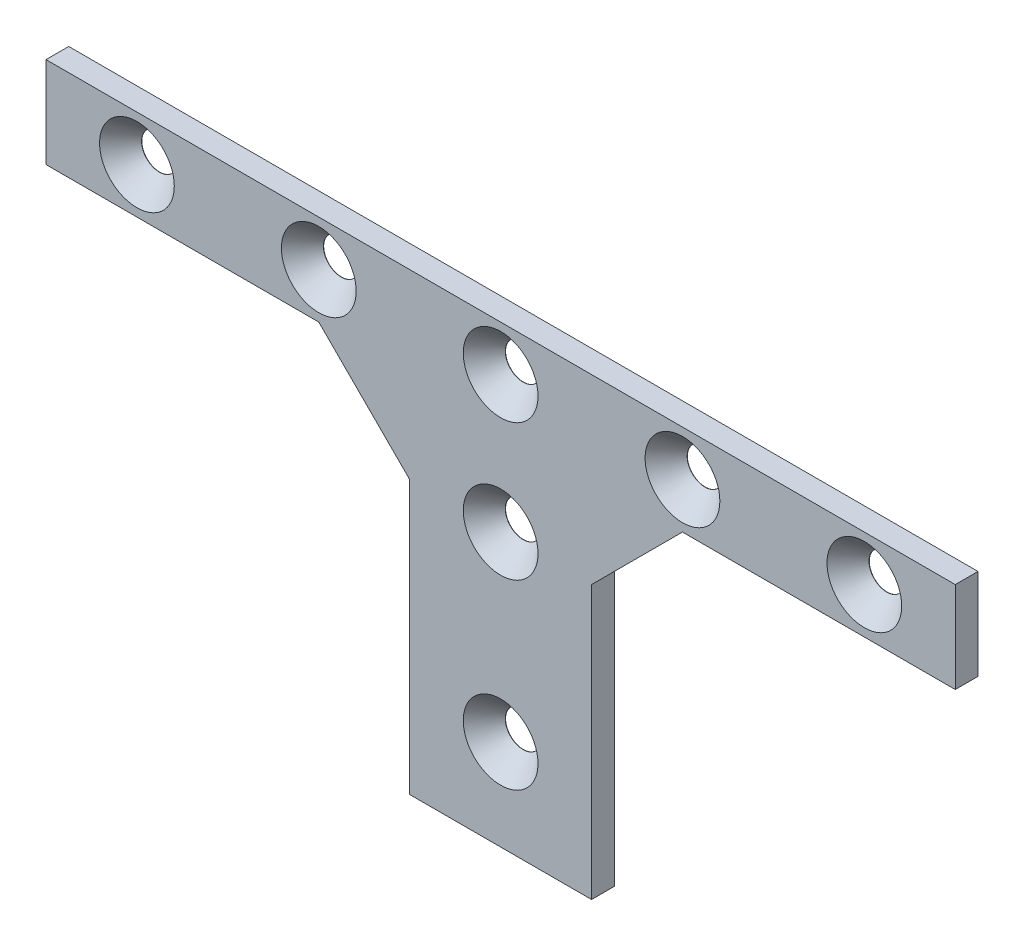
ISO-10303-21;
HEADER;
FILE_DESCRIPTION(('STEP AP214'),'2;1');
FILE_NAME('part.step','',(''),(''),'','','');
FILE_SCHEMA(('AUTOMOTIVE_DESIGN { 1 0 10303 214 1 1 1 1 }'));
ENDSEC;
DATA;
#1=APPLICATION_CONTEXT('core data for automotive mechanical design processes');
#2=APPLICATION_PROTOCOL_DEFINITION('international standard','automotive_design',2000,#1);
#3=PRODUCT_CONTEXT('',#1,'mechanical');
#4=PRODUCT('Part','Part','',(#3));
#5=PRODUCT_RELATED_PRODUCT_CATEGORY('part','',(#4));
#6=PRODUCT_DEFINITION_FORMATION('','',#4);
#7=PRODUCT_DEFINITION_CONTEXT('part definition',#1,'design');
#8=PRODUCT_DEFINITION('design','',#6,#7);
#9=PRODUCT_DEFINITION_SHAPE('','',#8);
#10=(LENGTH_UNIT() NAMED_UNIT(*) SI_UNIT(.MILLI.,.METRE.));
#11=(NAMED_UNIT(*) PLANE_ANGLE_UNIT() SI_UNIT($,.RADIAN.));
#12=(NAMED_UNIT(*) SI_UNIT($,.STERADIAN.) SOLID_ANGLE_UNIT());
#13=UNCERTAINTY_MEASURE_WITH_UNIT(LENGTH_MEASURE(1.E-05),#10,'distance_accuracy_value','');
#14=(GEOMETRIC_REPRESENTATION_CONTEXT(3) GLOBAL_UNCERTAINTY_ASSIGNED_CONTEXT((#13)) GLOBAL_UNIT_ASSIGNED_CONTEXT((#10,
#11,#12)) REPRESENTATION_CONTEXT('',''));
#15=CARTESIAN_POINT('',(0.,0.,0.));
#16=DIRECTION('',(0.,0.,1.));
#17=DIRECTION('',(1.,0.,0.));
#18=AXIS2_PLACEMENT_3D('',#15,#16,#17);
#19=CARTESIAN_POINT('',(41.2749999999985,-63.5,3.175));
#20=DIRECTION('',(0.,1.,0.));
#21=DIRECTION('',(0.,0.,1.));
#22=AXIS2_PLACEMENT_3D('',#19,#20,#21);
#23=PLANE('',#22);
#24=DIRECTION('',(1.,0.,0.));
#25=VECTOR('',#24,1.);
#26=CARTESIAN_POINT('',(41.2749999999985,-63.5,0.));
#27=LINE('',#26,#25);
#28=CARTESIAN_POINT('',(41.2749999999985,-63.5,0.));
#29=VERTEX_POINT('',#28);
#30=CARTESIAN_POINT('',(66.6749999999986,-63.5,0.));
#31=VERTEX_POINT('',#30);
#32=EDGE_CURVE('E146',#29,#31,#27,.T.);
#33=ORIENTED_EDGE('',*,*,#32,.T.);
#34=DIRECTION('',(0.,0.,-1.));
#35=VECTOR('',#34,1.);
#36=CARTESIAN_POINT('',(66.6749999999986,-63.5,3.175));
#37=LINE('',#36,#35);
#38=CARTESIAN_POINT('',(66.6749999999986,-63.5,3.175));
#39=VERTEX_POINT('',#38);
#40=EDGE_CURVE('E11',#39,#31,#37,.T.);
#41=ORIENTED_EDGE('',*,*,#40,.F.);
#42=DIRECTION('',(1.,0.,0.));
#43=VECTOR('',#42,1.);
#44=CARTESIAN_POINT('',(41.2749999999985,-63.5,3.175));
#45=LINE('',#44,#43);
#46=CARTESIAN_POINT('',(41.2749999999985,-63.5,3.175));
#47=VERTEX_POINT('',#46);
#48=EDGE_CURVE('E165',#47,#39,#45,.T.);
#49=ORIENTED_EDGE('',*,*,#48,.F.);
#50=DIRECTION('',(0.,0.,-1.));
#51=VECTOR('',#50,1.);
#52=CARTESIAN_POINT('',(41.2749999999985,-63.5,3.175));
#53=LINE('',#52,#51);
#54=EDGE_CURVE('E142',#47,#29,#53,.T.);
#55=ORIENTED_EDGE('',*,*,#54,.T.);
#56=EDGE_LOOP('',(#33,#41,#49,#55));
#57=FACE_BOUND('',#56,.T.);
#58=ADVANCED_FACE('F38',(#57),#23,.F.);
#59=CARTESIAN_POINT('',(66.6749999999986,-63.5,3.175));
#60=DIRECTION('',(-1.,0.,0.));
#61=DIRECTION('',(0.,0.,1.));
#62=AXIS2_PLACEMENT_3D('',#59,#60,#61);
#63=PLANE('',#62);
#64=DIRECTION('',(0.,1.,0.));
#65=VECTOR('',#64,1.);
#66=CARTESIAN_POINT('',(66.6749999999986,-63.5,0.));
#67=LINE('',#66,#65);
#68=CARTESIAN_POINT('',(66.6749999999986,-25.4,0.));
#69=VERTEX_POINT('',#68);
#70=EDGE_CURVE('E149',#31,#69,#67,.T.);
#71=ORIENTED_EDGE('',*,*,#70,.T.);
#72=DIRECTION('',(0.,0.,-1.));
#73=VECTOR('',#72,1.);
#74=CARTESIAN_POINT('',(66.6749999999986,-25.4,3.175));
#75=LINE('',#74,#73);
#76=CARTESIAN_POINT('',(66.6749999999986,-25.4,3.175));
#77=VERTEX_POINT('',#76);
#78=EDGE_CURVE('E46',#77,#69,#75,.T.);
#79=ORIENTED_EDGE('',*,*,#78,.F.);
#80=DIRECTION('',(0.,1.,0.));
#81=VECTOR('',#80,1.);
#82=CARTESIAN_POINT('',(66.6749999999986,-63.5,3.175));
#83=LINE('',#82,#81);
#84=EDGE_CURVE('E103',#39,#77,#83,.T.);
#85=ORIENTED_EDGE('',*,*,#84,.F.);
#86=ORIENTED_EDGE('',*,*,#40,.T.);
#87=EDGE_LOOP('',(#71,#79,#85,#86));
#88=FACE_BOUND('',#87,.T.);
#89=ADVANCED_FACE('F310',(#88),#63,.F.);
#90=CARTESIAN_POINT('',(66.6749999999986,-25.4,3.175));
#91=DIRECTION('',(-0.707106781186562,0.707106781186533,0.));
#92=DIRECTION('',(-0.707106781186533,-0.707106781186562,0.));
#93=AXIS2_PLACEMENT_3D('',#90,#91,#92);
#94=PLANE('',#93);
#95=DIRECTION('',(0.707106781186533,0.707106781186562,0.));
#96=VECTOR('',#95,1.);
#97=CARTESIAN_POINT('',(66.6749999999986,-25.4,0.));
#98=LINE('',#97,#96);
#99=CARTESIAN_POINT('',(79.3749999999981,-12.7,0.));
#100=VERTEX_POINT('',#99);
#101=EDGE_CURVE('E152',#69,#100,#98,.T.);
#102=ORIENTED_EDGE('',*,*,#101,.T.);
#103=DIRECTION('',(0.,0.,-1.));
#104=VECTOR('',#103,1.);
#105=CARTESIAN_POINT('',(79.3749999999981,-12.7,3.175));
#106=LINE('',#105,#104);
#107=CARTESIAN_POINT('',(79.3749999999981,-12.7,3.175));
#108=VERTEX_POINT('',#107);
#109=EDGE_CURVE('E178',#108,#100,#106,.T.);
#110=ORIENTED_EDGE('',*,*,#109,.F.);
#111=DIRECTION('',(0.707106781186533,0.707106781186562,0.));
#112=VECTOR('',#111,1.);
#113=CARTESIAN_POINT('',(66.6749999999986,-25.4,3.175));
#114=LINE('',#113,#112);
#115=EDGE_CURVE('E186',#77,#108,#114,.T.);
#116=ORIENTED_EDGE('',*,*,#115,.F.);
#117=ORIENTED_EDGE('',*,*,#78,.T.);
#118=EDGE_LOOP('',(#102,#110,#116,#117));
#119=FACE_BOUND('',#118,.T.);
#120=ADVANCED_FACE('F184',(#119),#94,.F.);
#121=CARTESIAN_POINT('',(79.3749999999981,-12.7,3.175));
#122=DIRECTION('',(0.,1.,0.));
#123=DIRECTION('',(-1.,0.,0.));
#124=AXIS2_PLACEMENT_3D('',#121,#122,#123);
#125=PLANE('',#124);
#126=DIRECTION('',(1.,0.,0.));
#127=VECTOR('',#126,1.);
#128=CARTESIAN_POINT('',(79.3749999999981,-12.7,0.));
#129=LINE('',#128,#127);
#130=CARTESIAN_POINT('',(117.474999999999,-12.6999999999999,0.));
#131=VERTEX_POINT('',#130);
#132=EDGE_CURVE('E154',#100,#131,#129,.T.);
#133=ORIENTED_EDGE('',*,*,#132,.T.);
#134=DIRECTION('',(0.,0.,-1.));
#135=VECTOR('',#134,1.);
#136=CARTESIAN_POINT('',(117.474999999999,-12.6999999999999,3.175));
#137=LINE('',#136,#135);
#138=CARTESIAN_POINT('',(117.474999999999,-12.6999999999999,3.175));
#139=VERTEX_POINT('',#138);
#140=EDGE_CURVE('E175',#139,#131,#137,.T.);
#141=ORIENTED_EDGE('',*,*,#140,.F.);
#142=DIRECTION('',(1.,0.,0.));
#143=VECTOR('',#142,1.);
#144=CARTESIAN_POINT('',(79.3749999999981,-12.7,3.175));
#145=LINE('',#144,#143);
#146=EDGE_CURVE('E204',#108,#139,#145,.T.);
#147=ORIENTED_EDGE('',*,*,#146,.F.);
#148=ORIENTED_EDGE('',*,*,#109,.T.);
#149=EDGE_LOOP('',(#133,#141,#147,#148));
#150=FACE_BOUND('',#149,.T.);
#151=ADVANCED_FACE('F195',(#150),#125,.F.);
#152=CARTESIAN_POINT('',(117.474999999999,-12.6999999999999,3.175));
#153=DIRECTION('',(-1.,0.,0.));
#154=DIRECTION('',(0.,0.,1.));
#155=AXIS2_PLACEMENT_3D('',#152,#153,#154);
#156=PLANE('',#155);
#157=DIRECTION('',(0.,1.,0.));
#158=VECTOR('',#157,1.);
#159=CARTESIAN_POINT('',(117.474999999999,-12.6999999999999,0.));
#160=LINE('',#159,#158);
#161=CARTESIAN_POINT('',(117.474999999999,-3.33066907387547E-13,0.));
#162=VERTEX_POINT('',#161);
#163=EDGE_CURVE('E156',#131,#162,#160,.T.);
#164=ORIENTED_EDGE('',*,*,#163,.T.);
#165=DIRECTION('',(0.,0.,-1.));
#166=VECTOR('',#165,1.);
#167=CARTESIAN_POINT('',(117.474999999999,-3.33066907387547E-13,3.175));
#168=LINE('',#167,#166);
#169=CARTESIAN_POINT('',(117.474999999999,-3.33066907387547E-13,3.175));
#170=VERTEX_POINT('',#169);
#171=EDGE_CURVE('E172',#170,#162,#168,.T.);
#172=ORIENTED_EDGE('',*,*,#171,.F.);
#173=DIRECTION('',(0.,1.,0.));
#174=VECTOR('',#173,1.);
#175=CARTESIAN_POINT('',(117.474999999999,-12.6999999999999,3.175));
#176=LINE('',#175,#174);
#177=EDGE_CURVE('E201',#139,#170,#176,.T.);
#178=ORIENTED_EDGE('',*,*,#177,.F.);
#179=ORIENTED_EDGE('',*,*,#140,.T.);
#180=EDGE_LOOP('',(#164,#172,#178,#179));
#181=FACE_BOUND('',#180,.T.);
#182=ADVANCED_FACE('F199',(#181),#156,.F.);
#183=CARTESIAN_POINT('',(117.474999999999,-3.33066907387547E-13,3.175));
#184=DIRECTION('',(0.,-1.,0.));
#185=DIRECTION('',(0.,0.,-1.));
#186=AXIS2_PLACEMENT_3D('',#183,#184,#185);
#187=PLANE('',#186);
#188=DIRECTION('',(-1.,0.,0.));
#189=VECTOR('',#188,1.);
#190=CARTESIAN_POINT('',(117.474999999999,-3.33066907387547E-13,0.));
#191=LINE('',#190,#189);
#192=CARTESIAN_POINT('',(-9.52500000000145,-3.33066907387547E-13,0.));
#193=VERTEX_POINT('',#192);
#194=EDGE_CURVE('E158',#162,#193,#191,.T.);
#195=ORIENTED_EDGE('',*,*,#194,.T.);
#196=DIRECTION('',(0.,0.,-1.));
#197=VECTOR('',#196,1.);
#198=CARTESIAN_POINT('',(-9.52500000000145,-3.33066907387547E-13,3.175));
#199=LINE('',#198,#197);
#200=CARTESIAN_POINT('',(-9.52500000000145,-3.33066907387547E-13,3.175));
#201=VERTEX_POINT('',#200);
#202=EDGE_CURVE('E169',#201,#193,#199,.T.);
#203=ORIENTED_EDGE('',*,*,#202,.F.);
#204=DIRECTION('',(-1.,0.,0.));
#205=VECTOR('',#204,1.);
#206=CARTESIAN_POINT('',(117.474999999999,-3.33066907387547E-13,3.175));
#207=LINE('',#206,#205);
#208=EDGE_CURVE('E203',#170,#201,#207,.T.);
#209=ORIENTED_EDGE('',*,*,#208,.F.);
#210=ORIENTED_EDGE('',*,*,#171,.T.);
#211=EDGE_LOOP('',(#195,#203,#209,#210));
#212=FACE_BOUND('',#211,.T.);
#213=ADVANCED_FACE('F322',(#212),#187,.F.);
#214=CARTESIAN_POINT('',(-9.52500000000145,-3.33066907387547E-13,3.175));
#215=DIRECTION('',(1.,0.,0.));
#216=DIRECTION('',(0.,0.,-1.));
#217=AXIS2_PLACEMENT_3D('',#214,#215,#216);
#218=PLANE('',#217);
#219=DIRECTION('',(0.,-1.,0.));
#220=VECTOR('',#219,1.);
#221=CARTESIAN_POINT('',(-9.52500000000145,-3.33066907387547E-13,0.));
#222=LINE('',#221,#220);
#223=CARTESIAN_POINT('',(-9.52500000000145,-12.6999999999999,0.));
#224=VERTEX_POINT('',#223);
#225=EDGE_CURVE('E160',#193,#224,#222,.T.);
#226=ORIENTED_EDGE('',*,*,#225,.T.);
#227=DIRECTION('',(0.,0.,-1.));
#228=VECTOR('',#227,1.);
#229=CARTESIAN_POINT('',(-9.52500000000145,-12.6999999999999,3.175));
#230=LINE('',#229,#228);
#231=CARTESIAN_POINT('',(-9.52500000000145,-12.6999999999999,3.175));
#232=VERTEX_POINT('',#231);
#233=EDGE_CURVE('E137',#232,#224,#230,.T.);
#234=ORIENTED_EDGE('',*,*,#233,.F.);
#235=DIRECTION('',(0.,-1.,0.));
#236=VECTOR('',#235,1.);
#237=CARTESIAN_POINT('',(-9.52500000000145,-3.33066907387547E-13,3.175));
#238=LINE('',#237,#236);
#239=EDGE_CURVE('E128',#201,#232,#238,.T.);
#240=ORIENTED_EDGE('',*,*,#239,.F.);
#241=ORIENTED_EDGE('',*,*,#202,.T.);
#242=EDGE_LOOP('',(#226,#234,#240,#241));
#243=FACE_BOUND('',#242,.T.);
#244=ADVANCED_FACE('F319',(#243),#218,.F.);
#245=CARTESIAN_POINT('',(-9.52500000000145,-12.6999999999999,3.175));
#246=DIRECTION('',(0.,1.,0.));
#247=DIRECTION('',(-1.,0.,0.));
#248=AXIS2_PLACEMENT_3D('',#245,#246,#247);
#249=PLANE('',#248);
#250=DIRECTION('',(1.,0.,0.));
#251=VECTOR('',#250,1.);
#252=CARTESIAN_POINT('',(-9.52500000000145,-12.6999999999999,0.));
#253=LINE('',#252,#251);
#254=CARTESIAN_POINT('',(28.5749999999979,-12.7,0.));
#255=VERTEX_POINT('',#254);
#256=EDGE_CURVE('E136',#224,#255,#253,.T.);
#257=ORIENTED_EDGE('',*,*,#256,.T.);
#258=DIRECTION('',(0.,0.,-1.));
#259=VECTOR('',#258,1.);
#260=CARTESIAN_POINT('',(28.5749999999979,-12.7,3.175));
#261=LINE('',#260,#259);
#262=CARTESIAN_POINT('',(28.5749999999979,-12.7,3.175));
#263=VERTEX_POINT('',#262);
#264=EDGE_CURVE('E133',#263,#255,#261,.T.);
#265=ORIENTED_EDGE('',*,*,#264,.F.);
#266=DIRECTION('',(1.,0.,0.));
#267=VECTOR('',#266,1.);
#268=CARTESIAN_POINT('',(-9.52500000000145,-12.6999999999999,3.175));
#269=LINE('',#268,#267);
#270=EDGE_CURVE('E122',#232,#263,#269,.T.);
#271=ORIENTED_EDGE('',*,*,#270,.F.);
#272=ORIENTED_EDGE('',*,*,#233,.T.);
#273=EDGE_LOOP('',(#257,#265,#271,#272));
#274=FACE_BOUND('',#273,.T.);
#275=ADVANCED_FACE('F134',(#274),#249,.F.);
#276=CARTESIAN_POINT('',(41.2749999999986,-25.4,3.175));
#277=DIRECTION('',(0.70710678118653,0.707106781186564,0.));
#278=DIRECTION('',(-0.707106781186565,0.70710678118653,0.));
#279=AXIS2_PLACEMENT_3D('',#276,#277,#278);
#280=PLANE('',#279);
#281=DIRECTION('',(0.707106781186565,-0.70710678118653,0.));
#282=VECTOR('',#281,1.);
#283=CARTESIAN_POINT('',(41.2749999999986,-25.4,0.));
#284=LINE('',#283,#282);
#285=CARTESIAN_POINT('',(41.2749999999986,-25.4,0.));
#286=VERTEX_POINT('',#285);
#287=EDGE_CURVE('E89',#255,#286,#284,.T.);
#288=ORIENTED_EDGE('',*,*,#287,.T.);
#289=DIRECTION('',(0.,0.,-1.));
#290=VECTOR('',#289,1.);
#291=CARTESIAN_POINT('',(41.2749999999986,-25.4,3.175));
#292=LINE('',#291,#290);
#293=CARTESIAN_POINT('',(41.2749999999986,-25.4,3.175));
#294=VERTEX_POINT('',#293);
#295=EDGE_CURVE('E138',#294,#286,#292,.T.);
#296=ORIENTED_EDGE('',*,*,#295,.F.);
#297=DIRECTION('',(0.707106781186565,-0.70710678118653,0.));
#298=VECTOR('',#297,1.);
#299=CARTESIAN_POINT('',(41.2749999999986,-25.4,3.175));
#300=LINE('',#299,#298);
#301=EDGE_CURVE('E126',#263,#294,#300,.T.);
#302=ORIENTED_EDGE('',*,*,#301,.F.);
#303=ORIENTED_EDGE('',*,*,#264,.T.);
#304=EDGE_LOOP('',(#288,#296,#302,#303));
#305=FACE_BOUND('',#304,.T.);
#306=ADVANCED_FACE('F140',(#305),#280,.F.);
#307=CARTESIAN_POINT('',(41.2749999999986,-25.4,3.175));
#308=DIRECTION('',(1.,0.,0.));
#309=DIRECTION('',(0.,1.,0.));
#310=AXIS2_PLACEMENT_3D('',#307,#308,#309);
#311=PLANE('',#310);
#312=DIRECTION('',(0.,-1.,0.));
#313=VECTOR('',#312,1.);
#314=CARTESIAN_POINT('',(41.2749999999986,-25.4,0.));
#315=LINE('',#314,#313);
#316=EDGE_CURVE('E95',#286,#29,#315,.T.);
#317=ORIENTED_EDGE('',*,*,#316,.T.);
#318=ORIENTED_EDGE('',*,*,#54,.F.);
#319=DIRECTION('',(0.,-1.,0.));
#320=VECTOR('',#319,1.);
#321=CARTESIAN_POINT('',(41.2749999999986,-25.4,3.175));
#322=LINE('',#321,#320);
#323=EDGE_CURVE('E54',#294,#47,#322,.T.);
#324=ORIENTED_EDGE('',*,*,#323,.F.);
#325=ORIENTED_EDGE('',*,*,#295,.T.);
#326=EDGE_LOOP('',(#317,#318,#324,#325));
#327=FACE_BOUND('',#326,.T.);
#328=ADVANCED_FACE('F279',(#327),#311,.F.);
#329=CARTESIAN_POINT('',(0.,0.,3.175));
#330=DIRECTION('',(0.,0.,1.));
#331=DIRECTION('',(1.,0.,0.));
#332=AXIS2_PLACEMENT_3D('',#329,#330,#331);
#333=PLANE('',#332);
#334=CARTESIAN_POINT('',(3.17499999999792,-6.35000000000014,3.175));
#335=DIRECTION('',(0.,0.,1.));
#336=DIRECTION('',(1.,0.,0.));
#337=AXIS2_PLACEMENT_3D('',#334,#335,#336);
#338=CIRCLE('',#337,5.2197);
#339=CARTESIAN_POINT('',(8.39469999999792,-6.35000000000014,3.175));
#340=VERTEX_POINT('',#339);
#341=EDGE_CURVE('E271',#340,#340,#338,.T.);
#342=ORIENTED_EDGE('',*,*,#341,.F.);
#343=EDGE_LOOP('',(#342));
#344=FACE_BOUND('',#343,.T.);
#345=CARTESIAN_POINT('',(28.5749999999979,-6.35000000000014,3.175));
#346=DIRECTION('',(0.,0.,1.));
#347=DIRECTION('',(1.,0.,0.));
#348=AXIS2_PLACEMENT_3D('',#345,#346,#347);
#349=CIRCLE('',#348,5.2197);
#350=CARTESIAN_POINT('',(33.7946999999979,-6.35000000000014,3.175));
#351=VERTEX_POINT('',#350);
#352=EDGE_CURVE('E262',#351,#351,#349,.T.);
#353=ORIENTED_EDGE('',*,*,#352,.F.);
#354=EDGE_LOOP('',(#353));
#355=FACE_BOUND('',#354,.T.);
#356=CARTESIAN_POINT('',(53.9749999999986,-6.35000000000014,3.175));
#357=DIRECTION('',(0.,0.,1.));
#358=DIRECTION('',(1.,0.,0.));
#359=AXIS2_PLACEMENT_3D('',#356,#357,#358);
#360=CIRCLE('',#359,5.2197);
#361=CARTESIAN_POINT('',(59.1946999999986,-6.35000000000014,3.175));
#362=VERTEX_POINT('',#361);
#363=EDGE_CURVE('E253',#362,#362,#360,.T.);
#364=ORIENTED_EDGE('',*,*,#363,.F.);
#365=EDGE_LOOP('',(#364));
#366=FACE_BOUND('',#365,.T.);
#367=CARTESIAN_POINT('',(104.774999999999,-6.35000000000014,3.175));
#368=DIRECTION('',(0.,0.,1.));
#369=DIRECTION('',(1.,0.,0.));
#370=AXIS2_PLACEMENT_3D('',#367,#368,#369);
#371=CIRCLE('',#370,5.21969999999999);
#372=CARTESIAN_POINT('',(109.994699999999,-6.35000000000014,3.175));
#373=VERTEX_POINT('',#372);
#374=EDGE_CURVE('E244',#373,#373,#371,.T.);
#375=ORIENTED_EDGE('',*,*,#374,.F.);
#376=EDGE_LOOP('',(#375));
#377=FACE_BOUND('',#376,.T.);
#378=CARTESIAN_POINT('',(53.9749999999986,-25.3999999999999,3.175));
#379=DIRECTION('',(0.,0.,1.));
#380=DIRECTION('',(1.,0.,0.));
#381=AXIS2_PLACEMENT_3D('',#378,#379,#380);
#382=CIRCLE('',#381,5.2197);
#383=CARTESIAN_POINT('',(59.1946999999986,-25.3999999999999,3.175));
#384=VERTEX_POINT('',#383);
#385=EDGE_CURVE('E235',#384,#384,#382,.T.);
#386=ORIENTED_EDGE('',*,*,#385,.F.);
#387=EDGE_LOOP('',(#386));
#388=FACE_BOUND('',#387,.T.);
#389=CARTESIAN_POINT('',(53.9749999999986,-50.7999999999999,3.175));
#390=DIRECTION('',(0.,0.,1.));
#391=DIRECTION('',(1.,0.,0.));
#392=AXIS2_PLACEMENT_3D('',#389,#390,#391);
#393=CIRCLE('',#392,5.2197);
#394=CARTESIAN_POINT('',(59.1946999999986,-50.7999999999999,3.175));
#395=VERTEX_POINT('',#394);
#396=EDGE_CURVE('E226',#395,#395,#393,.T.);
#397=ORIENTED_EDGE('',*,*,#396,.F.);
#398=EDGE_LOOP('',(#397));
#399=FACE_BOUND('',#398,.T.);
#400=CARTESIAN_POINT('',(79.3749999999981,-6.35000000000014,3.175));
#401=DIRECTION('',(0.,0.,1.));
#402=DIRECTION('',(1.,0.,0.));
#403=AXIS2_PLACEMENT_3D('',#400,#401,#402);
#404=CIRCLE('',#403,5.21969999999999);
#405=CARTESIAN_POINT('',(84.5946999999981,-6.35000000000014,3.175));
#406=VERTEX_POINT('',#405);
#407=EDGE_CURVE('E217',#406,#406,#404,.T.);
#408=ORIENTED_EDGE('',*,*,#407,.F.);
#409=EDGE_LOOP('',(#408));
#410=FACE_BOUND('',#409,.T.);
#411=ORIENTED_EDGE('',*,*,#48,.T.);
#412=ORIENTED_EDGE('',*,*,#84,.T.);
#413=ORIENTED_EDGE('',*,*,#115,.T.);
#414=ORIENTED_EDGE('',*,*,#146,.T.);
#415=ORIENTED_EDGE('',*,*,#177,.T.);
#416=ORIENTED_EDGE('',*,*,#208,.T.);
#417=ORIENTED_EDGE('',*,*,#239,.T.);
#418=ORIENTED_EDGE('',*,*,#270,.T.);
#419=ORIENTED_EDGE('',*,*,#301,.T.);
#420=ORIENTED_EDGE('',*,*,#323,.T.);
#421=EDGE_LOOP('',(#411,#412,#413,#414,#415,#416,#417,#418,#419,#420));
#422=FACE_BOUND('',#421,.T.);
#423=ADVANCED_FACE('F124',(#344,#355,#366,#377,#388,#399,#410,#422),#333,.T.);
#424=CARTESIAN_POINT('',(0.,0.,0.));
#425=DIRECTION('',(0.,0.,1.));
#426=DIRECTION('',(1.,0.,0.));
#427=AXIS2_PLACEMENT_3D('',#424,#425,#426);
#428=PLANE('',#427);
#429=CARTESIAN_POINT('',(3.17499999999792,-6.35000000000014,0.));
#430=DIRECTION('',(0.,0.,1.));
#431=DIRECTION('',(1.,0.,0.));
#432=AXIS2_PLACEMENT_3D('',#429,#430,#431);
#433=CIRCLE('',#432,2.48919999999999);
#434=CARTESIAN_POINT('',(5.66419999999791,-6.35000000000014,0.));
#435=VERTEX_POINT('',#434);
#436=EDGE_CURVE('E265',#435,#435,#433,.T.);
#437=ORIENTED_EDGE('',*,*,#436,.T.);
#438=EDGE_LOOP('',(#437));
#439=FACE_BOUND('',#438,.T.);
#440=CARTESIAN_POINT('',(28.5749999999979,-6.35000000000014,0.));
#441=DIRECTION('',(0.,0.,1.));
#442=DIRECTION('',(1.,0.,0.));
#443=AXIS2_PLACEMENT_3D('',#440,#441,#442);
#444=CIRCLE('',#443,2.48919999999999);
#445=CARTESIAN_POINT('',(31.0641999999979,-6.35000000000014,0.));
#446=VERTEX_POINT('',#445);
#447=EDGE_CURVE('E256',#446,#446,#444,.T.);
#448=ORIENTED_EDGE('',*,*,#447,.T.);
#449=EDGE_LOOP('',(#448));
#450=FACE_BOUND('',#449,.T.);
#451=CARTESIAN_POINT('',(53.9749999999986,-6.35000000000014,0.));
#452=DIRECTION('',(0.,0.,1.));
#453=DIRECTION('',(1.,0.,0.));
#454=AXIS2_PLACEMENT_3D('',#451,#452,#453);
#455=CIRCLE('',#454,2.48919999999999);
#456=CARTESIAN_POINT('',(56.4641999999985,-6.35000000000014,0.));
#457=VERTEX_POINT('',#456);
#458=EDGE_CURVE('E247',#457,#457,#455,.T.);
#459=ORIENTED_EDGE('',*,*,#458,.T.);
#460=EDGE_LOOP('',(#459));
#461=FACE_BOUND('',#460,.T.);
#462=CARTESIAN_POINT('',(104.774999999999,-6.35000000000014,0.));
#463=DIRECTION('',(0.,0.,1.));
#464=DIRECTION('',(1.,0.,0.));
#465=AXIS2_PLACEMENT_3D('',#462,#463,#464);
#466=CIRCLE('',#465,2.48919999999998);
#467=CARTESIAN_POINT('',(107.264199999999,-6.35000000000014,0.));
#468=VERTEX_POINT('',#467);
#469=EDGE_CURVE('E238',#468,#468,#466,.T.);
#470=ORIENTED_EDGE('',*,*,#469,.T.);
#471=EDGE_LOOP('',(#470));
#472=FACE_BOUND('',#471,.T.);
#473=CARTESIAN_POINT('',(53.9749999999986,-25.3999999999999,0.));
#474=DIRECTION('',(0.,0.,1.));
#475=DIRECTION('',(1.,0.,0.));
#476=AXIS2_PLACEMENT_3D('',#473,#474,#475);
#477=CIRCLE('',#476,2.48919999999999);
#478=CARTESIAN_POINT('',(56.4641999999985,-25.3999999999999,0.));
#479=VERTEX_POINT('',#478);
#480=EDGE_CURVE('E229',#479,#479,#477,.T.);
#481=ORIENTED_EDGE('',*,*,#480,.T.);
#482=EDGE_LOOP('',(#481));
#483=FACE_BOUND('',#482,.T.);
#484=CARTESIAN_POINT('',(53.9749999999986,-50.7999999999999,0.));
#485=DIRECTION('',(0.,0.,1.));
#486=DIRECTION('',(1.,0.,0.));
#487=AXIS2_PLACEMENT_3D('',#484,#485,#486);
#488=CIRCLE('',#487,2.48919999999999);
#489=CARTESIAN_POINT('',(56.4641999999985,-50.7999999999999,0.));
#490=VERTEX_POINT('',#489);
#491=EDGE_CURVE('E220',#490,#490,#488,.T.);
#492=ORIENTED_EDGE('',*,*,#491,.T.);
#493=EDGE_LOOP('',(#492));
#494=FACE_BOUND('',#493,.T.);
#495=CARTESIAN_POINT('',(79.3749999999981,-6.35000000000014,0.));
#496=DIRECTION('',(0.,0.,1.));
#497=DIRECTION('',(1.,0.,0.));
#498=AXIS2_PLACEMENT_3D('',#495,#496,#497);
#499=CIRCLE('',#498,2.48919999999998);
#500=CARTESIAN_POINT('',(81.864199999998,-6.35000000000014,0.));
#501=VERTEX_POINT('',#500);
#502=EDGE_CURVE('E150',#501,#501,#499,.T.);
#503=ORIENTED_EDGE('',*,*,#502,.T.);
#504=EDGE_LOOP('',(#503));
#505=FACE_BOUND('',#504,.T.);
#506=ORIENTED_EDGE('',*,*,#32,.F.);
#507=ORIENTED_EDGE('',*,*,#316,.F.);
#508=ORIENTED_EDGE('',*,*,#287,.F.);
#509=ORIENTED_EDGE('',*,*,#256,.F.);
#510=ORIENTED_EDGE('',*,*,#225,.F.);
#511=ORIENTED_EDGE('',*,*,#194,.F.);
#512=ORIENTED_EDGE('',*,*,#163,.F.);
#513=ORIENTED_EDGE('',*,*,#132,.F.);
#514=ORIENTED_EDGE('',*,*,#101,.F.);
#515=ORIENTED_EDGE('',*,*,#70,.F.);
#516=EDGE_LOOP('',(#506,#507,#508,#509,#510,#511,#512,#513,#514,#515));
#517=FACE_BOUND('',#516,.T.);
#518=ADVANCED_FACE('F190',(#439,#450,#461,#472,#483,#494,#505,#517),#428,.F.);
#519=CARTESIAN_POINT('',(79.3749999999981,-6.35000000000014,3.175));
#520=DIRECTION('',(0.,0.,1.));
#521=DIRECTION('',(1.,0.,0.));
#522=AXIS2_PLACEMENT_3D('',#519,#520,#521);
#523=CYLINDRICAL_SURFACE('',#522,2.48919999999999);
#524=ORIENTED_EDGE('',*,*,#502,.F.);
#525=EDGE_LOOP('',(#524));
#526=FACE_BOUND('',#525,.T.);
#527=CARTESIAN_POINT('',(79.3749999999981,-6.35000000000014,0.0339190640830326));
#528=DIRECTION('',(0.,0.,1.));
#529=DIRECTION('',(1.,0.,0.));
#530=AXIS2_PLACEMENT_3D('',#527,#528,#529);
#531=CIRCLE('',#530,2.4892);
#532=CARTESIAN_POINT('',(81.864199999998,-6.35000000000014,0.0339190640830326));
#533=VERTEX_POINT('',#532);
#534=EDGE_CURVE('E214',#533,#533,#531,.T.);
#535=ORIENTED_EDGE('',*,*,#534,.T.);
#536=EDGE_LOOP('',(#535));
#537=FACE_BOUND('',#536,.T.);
#538=ADVANCED_FACE('F296',(#526,#537),#523,.F.);
#539=CARTESIAN_POINT('',(79.3749999999981,-6.35000000000014,3.175));
#540=DIRECTION('',(0.,0.,1.));
#541=DIRECTION('',(1.,0.,0.));
#542=AXIS2_PLACEMENT_3D('',#539,#540,#541);
#543=CONICAL_SURFACE('',#542,5.21969999999999,0.715584993317674);
#544=ORIENTED_EDGE('',*,*,#534,.F.);
#545=EDGE_LOOP('',(#544));
#546=FACE_BOUND('',#545,.T.);
#547=ORIENTED_EDGE('',*,*,#407,.T.);
#548=EDGE_LOOP('',(#547));
#549=FACE_BOUND('',#548,.T.);
#550=ADVANCED_FACE('F293',(#546,#549),#543,.F.);
#551=CARTESIAN_POINT('',(53.9749999999986,-50.7999999999999,3.175));
#552=DIRECTION('',(0.,0.,1.));
#553=DIRECTION('',(1.,0.,0.));
#554=AXIS2_PLACEMENT_3D('',#551,#552,#553);
#555=CYLINDRICAL_SURFACE('',#554,2.48919999999999);
#556=ORIENTED_EDGE('',*,*,#491,.F.);
#557=EDGE_LOOP('',(#556));
#558=FACE_BOUND('',#557,.T.);
#559=CARTESIAN_POINT('',(53.9749999999986,-50.7999999999999,0.0339190640830326));
#560=DIRECTION('',(0.,0.,1.));
#561=DIRECTION('',(1.,0.,0.));
#562=AXIS2_PLACEMENT_3D('',#559,#560,#561);
#563=CIRCLE('',#562,2.4892);
#564=CARTESIAN_POINT('',(56.4641999999985,-50.7999999999999,0.0339190640830326));
#565=VERTEX_POINT('',#564);
#566=EDGE_CURVE('E223',#565,#565,#563,.T.);
#567=ORIENTED_EDGE('',*,*,#566,.T.);
#568=EDGE_LOOP('',(#567));
#569=FACE_BOUND('',#568,.T.);
#570=ADVANCED_FACE('F295',(#558,#569),#555,.F.);
#571=CARTESIAN_POINT('',(53.9749999999986,-50.7999999999999,3.175));
#572=DIRECTION('',(0.,0.,1.));
#573=DIRECTION('',(1.,0.,0.));
#574=AXIS2_PLACEMENT_3D('',#571,#572,#573);
#575=CONICAL_SURFACE('',#574,5.2197,0.715584993317676);
#576=ORIENTED_EDGE('',*,*,#566,.F.);
#577=EDGE_LOOP('',(#576));
#578=FACE_BOUND('',#577,.T.);
#579=ORIENTED_EDGE('',*,*,#396,.T.);
#580=EDGE_LOOP('',(#579));
#581=FACE_BOUND('',#580,.T.);
#582=ADVANCED_FACE('F303',(#578,#581),#575,.F.);
#583=CARTESIAN_POINT('',(53.9749999999986,-25.3999999999999,3.175));
#584=DIRECTION('',(0.,0.,1.));
#585=DIRECTION('',(1.,0.,0.));
#586=AXIS2_PLACEMENT_3D('',#583,#584,#585);
#587=CYLINDRICAL_SURFACE('',#586,2.48919999999999);
#588=ORIENTED_EDGE('',*,*,#480,.F.);
#589=EDGE_LOOP('',(#588));
#590=FACE_BOUND('',#589,.T.);
#591=CARTESIAN_POINT('',(53.9749999999986,-25.3999999999999,0.0339190640830326));
#592=DIRECTION('',(0.,0.,1.));
#593=DIRECTION('',(1.,0.,0.));
#594=AXIS2_PLACEMENT_3D('',#591,#592,#593);
#595=CIRCLE('',#594,2.4892);
#596=CARTESIAN_POINT('',(56.4641999999985,-25.3999999999999,0.0339190640830326));
#597=VERTEX_POINT('',#596);
#598=EDGE_CURVE('E232',#597,#597,#595,.T.);
#599=ORIENTED_EDGE('',*,*,#598,.T.);
#600=EDGE_LOOP('',(#599));
#601=FACE_BOUND('',#600,.T.);
#602=ADVANCED_FACE('F432',(#590,#601),#587,.F.);
#603=CARTESIAN_POINT('',(53.9749999999986,-25.3999999999999,3.175));
#604=DIRECTION('',(0.,0.,1.));
#605=DIRECTION('',(1.,0.,0.));
#606=AXIS2_PLACEMENT_3D('',#603,#604,#605);
#607=CONICAL_SURFACE('',#606,5.2197,0.715584993317676);
#608=ORIENTED_EDGE('',*,*,#598,.F.);
#609=EDGE_LOOP('',(#608));
#610=FACE_BOUND('',#609,.T.);
#611=ORIENTED_EDGE('',*,*,#385,.T.);
#612=EDGE_LOOP('',(#611));
#613=FACE_BOUND('',#612,.T.);
#614=ADVANCED_FACE('F443',(#610,#613),#607,.F.);
#615=CARTESIAN_POINT('',(104.774999999999,-6.35000000000014,3.175));
#616=DIRECTION('',(0.,0.,1.));
#617=DIRECTION('',(1.,0.,0.));
#618=AXIS2_PLACEMENT_3D('',#615,#616,#617);
#619=CYLINDRICAL_SURFACE('',#618,2.48919999999999);
#620=ORIENTED_EDGE('',*,*,#469,.F.);
#621=EDGE_LOOP('',(#620));
#622=FACE_BOUND('',#621,.T.);
#623=CARTESIAN_POINT('',(104.774999999999,-6.35000000000014,0.0339190640830326));
#624=DIRECTION('',(0.,0.,1.));
#625=DIRECTION('',(1.,0.,0.));
#626=AXIS2_PLACEMENT_3D('',#623,#624,#625);
#627=CIRCLE('',#626,2.4892);
#628=CARTESIAN_POINT('',(107.264199999999,-6.35000000000014,0.0339190640830326));
#629=VERTEX_POINT('',#628);
#630=EDGE_CURVE('E241',#629,#629,#627,.T.);
#631=ORIENTED_EDGE('',*,*,#630,.T.);
#632=EDGE_LOOP('',(#631));
#633=FACE_BOUND('',#632,.T.);
#634=ADVANCED_FACE('F454',(#622,#633),#619,.F.);
#635=CARTESIAN_POINT('',(104.774999999999,-6.35000000000014,3.175));
#636=DIRECTION('',(0.,0.,1.));
#637=DIRECTION('',(1.,0.,0.));
#638=AXIS2_PLACEMENT_3D('',#635,#636,#637);
#639=CONICAL_SURFACE('',#638,5.21969999999999,0.715584993317674);
#640=ORIENTED_EDGE('',*,*,#630,.F.);
#641=EDGE_LOOP('',(#640));
#642=FACE_BOUND('',#641,.T.);
#643=ORIENTED_EDGE('',*,*,#374,.T.);
#644=EDGE_LOOP('',(#643));
#645=FACE_BOUND('',#644,.T.);
#646=ADVANCED_FACE('F465',(#642,#645),#639,.F.);
#647=CARTESIAN_POINT('',(53.9749999999986,-6.35000000000014,3.175));
#648=DIRECTION('',(0.,0.,1.));
#649=DIRECTION('',(1.,0.,0.));
#650=AXIS2_PLACEMENT_3D('',#647,#648,#649);
#651=CYLINDRICAL_SURFACE('',#650,2.48919999999999);
#652=ORIENTED_EDGE('',*,*,#458,.F.);
#653=EDGE_LOOP('',(#652));
#654=FACE_BOUND('',#653,.T.);
#655=CARTESIAN_POINT('',(53.9749999999986,-6.35000000000014,0.0339190640830326));
#656=DIRECTION('',(0.,0.,1.));
#657=DIRECTION('',(1.,0.,0.));
#658=AXIS2_PLACEMENT_3D('',#655,#656,#657);
#659=CIRCLE('',#658,2.4892);
#660=CARTESIAN_POINT('',(56.4641999999985,-6.35000000000014,0.0339190640830326));
#661=VERTEX_POINT('',#660);
#662=EDGE_CURVE('E250',#661,#661,#659,.T.);
#663=ORIENTED_EDGE('',*,*,#662,.T.);
#664=EDGE_LOOP('',(#663));
#665=FACE_BOUND('',#664,.T.);
#666=ADVANCED_FACE('F476',(#654,#665),#651,.F.);
#667=CARTESIAN_POINT('',(53.9749999999986,-6.35000000000014,3.175));
#668=DIRECTION('',(0.,0.,1.));
#669=DIRECTION('',(1.,0.,0.));
#670=AXIS2_PLACEMENT_3D('',#667,#668,#669);
#671=CONICAL_SURFACE('',#670,5.2197,0.715584993317676);
#672=ORIENTED_EDGE('',*,*,#662,.F.);
#673=EDGE_LOOP('',(#672));
#674=FACE_BOUND('',#673,.T.);
#675=ORIENTED_EDGE('',*,*,#363,.T.);
#676=EDGE_LOOP('',(#675));
#677=FACE_BOUND('',#676,.T.);
#678=ADVANCED_FACE('F487',(#674,#677),#671,.F.);
#679=CARTESIAN_POINT('',(28.5749999999979,-6.35000000000014,3.175));
#680=DIRECTION('',(0.,0.,1.));
#681=DIRECTION('',(1.,0.,0.));
#682=AXIS2_PLACEMENT_3D('',#679,#680,#681);
#683=CYLINDRICAL_SURFACE('',#682,2.48919999999999);
#684=ORIENTED_EDGE('',*,*,#447,.F.);
#685=EDGE_LOOP('',(#684));
#686=FACE_BOUND('',#685,.T.);
#687=CARTESIAN_POINT('',(28.5749999999979,-6.35000000000014,0.0339190640830326));
#688=DIRECTION('',(0.,0.,1.));
#689=DIRECTION('',(1.,0.,0.));
#690=AXIS2_PLACEMENT_3D('',#687,#688,#689);
#691=CIRCLE('',#690,2.4892);
#692=CARTESIAN_POINT('',(31.0641999999979,-6.35000000000014,0.0339190640830326));
#693=VERTEX_POINT('',#692);
#694=EDGE_CURVE('E259',#693,#693,#691,.T.);
#695=ORIENTED_EDGE('',*,*,#694,.T.);
#696=EDGE_LOOP('',(#695));
#697=FACE_BOUND('',#696,.T.);
#698=ADVANCED_FACE('F498',(#686,#697),#683,.F.);
#699=CARTESIAN_POINT('',(28.5749999999979,-6.35000000000014,3.175));
#700=DIRECTION('',(0.,0.,1.));
#701=DIRECTION('',(1.,0.,0.));
#702=AXIS2_PLACEMENT_3D('',#699,#700,#701);
#703=CONICAL_SURFACE('',#702,5.2197,0.715584993317675);
#704=ORIENTED_EDGE('',*,*,#694,.F.);
#705=EDGE_LOOP('',(#704));
#706=FACE_BOUND('',#705,.T.);
#707=ORIENTED_EDGE('',*,*,#352,.T.);
#708=EDGE_LOOP('',(#707));
#709=FACE_BOUND('',#708,.T.);
#710=ADVANCED_FACE('F509',(#706,#709),#703,.F.);
#711=CARTESIAN_POINT('',(3.17499999999792,-6.35000000000014,3.175));
#712=DIRECTION('',(0.,0.,1.));
#713=DIRECTION('',(1.,0.,0.));
#714=AXIS2_PLACEMENT_3D('',#711,#712,#713);
#715=CYLINDRICAL_SURFACE('',#714,2.48919999999999);
#716=ORIENTED_EDGE('',*,*,#436,.F.);
#717=EDGE_LOOP('',(#716));
#718=FACE_BOUND('',#717,.T.);
#719=CARTESIAN_POINT('',(3.17499999999792,-6.35000000000014,0.0339190640830326));
#720=DIRECTION('',(0.,0.,1.));
#721=DIRECTION('',(1.,0.,0.));
#722=AXIS2_PLACEMENT_3D('',#719,#720,#721);
#723=CIRCLE('',#722,2.4892);
#724=CARTESIAN_POINT('',(5.66419999999792,-6.35000000000014,0.0339190640830326));
#725=VERTEX_POINT('',#724);
#726=EDGE_CURVE('E268',#725,#725,#723,.T.);
#727=ORIENTED_EDGE('',*,*,#726,.T.);
#728=EDGE_LOOP('',(#727));
#729=FACE_BOUND('',#728,.T.);
#730=ADVANCED_FACE('F520',(#718,#729),#715,.F.);
#731=CARTESIAN_POINT('',(3.17499999999792,-6.35000000000014,3.175));
#732=DIRECTION('',(0.,0.,1.));
#733=DIRECTION('',(1.,0.,0.));
#734=AXIS2_PLACEMENT_3D('',#731,#732,#733);
#735=CONICAL_SURFACE('',#734,5.2197,0.715584993317675);
#736=ORIENTED_EDGE('',*,*,#726,.F.);
#737=EDGE_LOOP('',(#736));
#738=FACE_BOUND('',#737,.T.);
#739=ORIENTED_EDGE('',*,*,#341,.T.);
#740=EDGE_LOOP('',(#739));
#741=FACE_BOUND('',#740,.T.);
#742=ADVANCED_FACE('F275',(#738,#741),#735,.F.);
#743=CLOSED_SHELL('',(#58,#89,#120,#151,#182,#213,#244,#275,#306,#328,#423,#518,#538,#550,#570,
#582,#602,#614,#634,#646,#666,#678,#698,#710,#730,#742));
#744=MANIFOLD_SOLID_BREP('B2',#743);
#745=ADVANCED_BREP_SHAPE_REPRESENTATION('',(#18,#744),#14);
#746=SHAPE_DEFINITION_REPRESENTATION(#9,#745);
ENDSEC;
END-ISO-10303-21;
